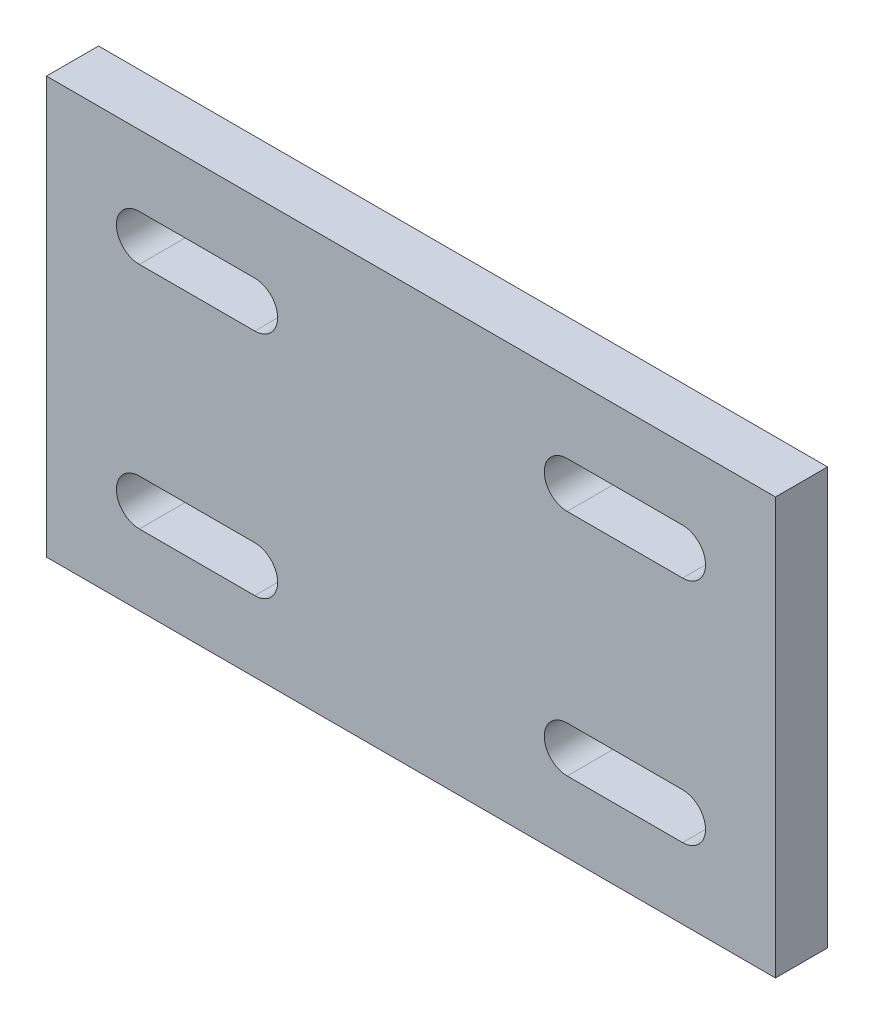
ISO-10303-21;
HEADER;
FILE_DESCRIPTION(('STEP AP214'),'2;1');
FILE_NAME('part.step','',(''),(''),'','','');
FILE_SCHEMA(('AUTOMOTIVE_DESIGN { 1 0 10303 214 1 1 1 1 }'));
ENDSEC;
DATA;
#1=APPLICATION_CONTEXT('core data for automotive mechanical design processes');
#2=APPLICATION_PROTOCOL_DEFINITION('international standard','automotive_design',2000,#1);
#3=PRODUCT_CONTEXT('',#1,'mechanical');
#4=PRODUCT('Part','Part','',(#3));
#5=PRODUCT_RELATED_PRODUCT_CATEGORY('part','',(#4));
#6=PRODUCT_DEFINITION_FORMATION('','',#4);
#7=PRODUCT_DEFINITION_CONTEXT('part definition',#1,'design');
#8=PRODUCT_DEFINITION('design','',#6,#7);
#9=PRODUCT_DEFINITION_SHAPE('','',#8);
#10=(LENGTH_UNIT() NAMED_UNIT(*) SI_UNIT(.MILLI.,.METRE.));
#11=(NAMED_UNIT(*) PLANE_ANGLE_UNIT() SI_UNIT($,.RADIAN.));
#12=(NAMED_UNIT(*) SI_UNIT($,.STERADIAN.) SOLID_ANGLE_UNIT());
#13=UNCERTAINTY_MEASURE_WITH_UNIT(LENGTH_MEASURE(1.E-05),#10,'distance_accuracy_value','');
#14=(GEOMETRIC_REPRESENTATION_CONTEXT(3) GLOBAL_UNCERTAINTY_ASSIGNED_CONTEXT((#13)) GLOBAL_UNIT_ASSIGNED_CONTEXT((#10,
#11,#12)) REPRESENTATION_CONTEXT('',''));
#15=CARTESIAN_POINT('',(0.,0.,0.));
#16=DIRECTION('',(0.,0.,1.));
#17=DIRECTION('',(1.,0.,0.));
#18=AXIS2_PLACEMENT_3D('',#15,#16,#17);
#19=CARTESIAN_POINT('',(0.,0.,5.));
#20=DIRECTION('',(0.,0.,-1.));
#21=DIRECTION('',(-1.,0.,0.));
#22=AXIS2_PLACEMENT_3D('',#19,#20,#21);
#23=PLANE('',#22);
#24=CARTESIAN_POINT('',(26.080867748854,11.,5.));
#25=DIRECTION('',(0.,0.,-1.));
#26=DIRECTION('',(-1.,0.,0.));
#27=AXIS2_PLACEMENT_3D('',#24,#25,#26);
#28=CIRCLE('',#27,2.2);
#29=CARTESIAN_POINT('',(26.080867748854,13.2,5.));
#30=VERTEX_POINT('',#29);
#31=CARTESIAN_POINT('',(26.080867748854,8.8,5.));
#32=VERTEX_POINT('',#31);
#33=EDGE_CURVE('E258',#30,#32,#28,.T.);
#34=ORIENTED_EDGE('',*,*,#33,.T.);
#35=DIRECTION('',(-1.,0.,0.));
#36=VECTOR('',#35,1.);
#37=CARTESIAN_POINT('',(26.080867748854,8.8,5.));
#38=LINE('',#37,#36);
#39=CARTESIAN_POINT('',(15.,8.8,5.));
#40=VERTEX_POINT('',#39);
#41=EDGE_CURVE('E272',#32,#40,#38,.T.);
#42=ORIENTED_EDGE('',*,*,#41,.T.);
#43=CARTESIAN_POINT('',(15.,11.,5.));
#44=DIRECTION('',(0.,0.,-1.));
#45=DIRECTION('',(-1.,0.,0.));
#46=AXIS2_PLACEMENT_3D('',#43,#44,#45);
#47=CIRCLE('',#46,2.2);
#48=CARTESIAN_POINT('',(15.,13.2,5.));
#49=VERTEX_POINT('',#48);
#50=EDGE_CURVE('E290',#40,#49,#47,.T.);
#51=ORIENTED_EDGE('',*,*,#50,.T.);
#52=DIRECTION('',(1.,0.,0.));
#53=VECTOR('',#52,1.);
#54=CARTESIAN_POINT('',(26.080867748854,13.2,5.));
#55=LINE('',#54,#53);
#56=EDGE_CURVE('E286',#49,#30,#55,.T.);
#57=ORIENTED_EDGE('',*,*,#56,.T.);
#58=EDGE_LOOP('',(#34,#42,#51,#57));
#59=FACE_BOUND('',#58,.T.);
#60=DIRECTION('',(1.,0.,0.));
#61=VECTOR('',#60,1.);
#62=CARTESIAN_POINT('',(-26.080867748854,8.8,5.));
#63=LINE('',#62,#61);
#64=CARTESIAN_POINT('',(-26.080867748854,8.8,5.));
#65=VERTEX_POINT('',#64);
#66=CARTESIAN_POINT('',(-15.,8.8,5.));
#67=VERTEX_POINT('',#66);
#68=EDGE_CURVE('E331',#65,#67,#63,.T.);
#69=ORIENTED_EDGE('',*,*,#68,.F.);
#70=CARTESIAN_POINT('',(-26.080867748854,11.,5.));
#71=DIRECTION('',(0.,0.,1.));
#72=DIRECTION('',(1.,0.,0.));
#73=AXIS2_PLACEMENT_3D('',#70,#71,#72);
#74=CIRCLE('',#73,2.2);
#75=CARTESIAN_POINT('',(-26.080867748854,13.2,5.));
#76=VERTEX_POINT('',#75);
#77=EDGE_CURVE('E301',#76,#65,#74,.T.);
#78=ORIENTED_EDGE('',*,*,#77,.F.);
#79=DIRECTION('',(-1.,0.,0.));
#80=VECTOR('',#79,1.);
#81=CARTESIAN_POINT('',(-26.080867748854,13.2,5.));
#82=LINE('',#81,#80);
#83=CARTESIAN_POINT('',(-15.,13.2,5.));
#84=VERTEX_POINT('',#83);
#85=EDGE_CURVE('E316',#84,#76,#82,.T.);
#86=ORIENTED_EDGE('',*,*,#85,.F.);
#87=CARTESIAN_POINT('',(-15.,11.,5.));
#88=DIRECTION('',(0.,0.,1.));
#89=DIRECTION('',(1.,0.,0.));
#90=AXIS2_PLACEMENT_3D('',#87,#88,#89);
#91=CIRCLE('',#90,2.2);
#92=EDGE_CURVE('E335',#67,#84,#91,.T.);
#93=ORIENTED_EDGE('',*,*,#92,.F.);
#94=EDGE_LOOP('',(#69,#78,#86,#93));
#95=FACE_BOUND('',#94,.T.);
#96=DIRECTION('',(0.,1.,0.));
#97=VECTOR('',#96,1.);
#98=CARTESIAN_POINT('',(35.,-20.,5.));
#99=LINE('',#98,#97);
#100=CARTESIAN_POINT('',(35.,-20.,5.));
#101=VERTEX_POINT('',#100);
#102=CARTESIAN_POINT('',(35.,20.,5.));
#103=VERTEX_POINT('',#102);
#104=EDGE_CURVE('E355',#101,#103,#99,.T.);
#105=ORIENTED_EDGE('',*,*,#104,.T.);
#106=DIRECTION('',(-1.,0.,0.));
#107=VECTOR('',#106,1.);
#108=CARTESIAN_POINT('',(-35.,20.,5.));
#109=LINE('',#108,#107);
#110=CARTESIAN_POINT('',(-35.,20.,5.));
#111=VERTEX_POINT('',#110);
#112=EDGE_CURVE('E359',#103,#111,#109,.T.);
#113=ORIENTED_EDGE('',*,*,#112,.T.);
#114=DIRECTION('',(0.,-1.,0.));
#115=VECTOR('',#114,1.);
#116=CARTESIAN_POINT('',(-35.,-20.,5.));
#117=LINE('',#116,#115);
#118=CARTESIAN_POINT('',(-35.,-20.,5.));
#119=VERTEX_POINT('',#118);
#120=EDGE_CURVE('E363',#111,#119,#117,.T.);
#121=ORIENTED_EDGE('',*,*,#120,.T.);
#122=DIRECTION('',(1.,0.,0.));
#123=VECTOR('',#122,1.);
#124=CARTESIAN_POINT('',(-35.,-20.,5.));
#125=LINE('',#124,#123);
#126=EDGE_CURVE('E366',#119,#101,#125,.T.);
#127=ORIENTED_EDGE('',*,*,#126,.T.);
#128=EDGE_LOOP('',(#105,#113,#121,#127));
#129=FACE_BOUND('',#128,.T.);
#130=DIRECTION('',(-1.,0.,0.));
#131=VECTOR('',#130,1.);
#132=CARTESIAN_POINT('',(26.080867748854,-8.8,5.));
#133=LINE('',#132,#131);
#134=CARTESIAN_POINT('',(26.080867748854,-8.8,5.));
#135=VERTEX_POINT('',#134);
#136=CARTESIAN_POINT('',(15.,-8.8,5.));
#137=VERTEX_POINT('',#136);
#138=EDGE_CURVE('E244',#135,#137,#133,.T.);
#139=ORIENTED_EDGE('',*,*,#138,.F.);
#140=CARTESIAN_POINT('',(26.080867748854,-11.,5.));
#141=DIRECTION('',(0.,0.,1.));
#142=DIRECTION('',(-1.,0.,0.));
#143=AXIS2_PLACEMENT_3D('',#140,#141,#142);
#144=CIRCLE('',#143,2.2);
#145=CARTESIAN_POINT('',(26.080867748854,-13.2,5.));
#146=VERTEX_POINT('',#145);
#147=EDGE_CURVE('E218',#146,#135,#144,.T.);
#148=ORIENTED_EDGE('',*,*,#147,.F.);
#149=DIRECTION('',(1.,0.,0.));
#150=VECTOR('',#149,1.);
#151=CARTESIAN_POINT('',(26.080867748854,-13.2,5.));
#152=LINE('',#151,#150);
#153=CARTESIAN_POINT('',(15.,-13.2,5.));
#154=VERTEX_POINT('',#153);
#155=EDGE_CURVE('E229',#154,#146,#152,.T.);
#156=ORIENTED_EDGE('',*,*,#155,.F.);
#157=CARTESIAN_POINT('',(15.,-11.,5.));
#158=DIRECTION('',(0.,0.,1.));
#159=DIRECTION('',(-1.,0.,0.));
#160=AXIS2_PLACEMENT_3D('',#157,#158,#159);
#161=CIRCLE('',#160,2.2);
#162=EDGE_CURVE('E248',#137,#154,#161,.T.);
#163=ORIENTED_EDGE('',*,*,#162,.F.);
#164=EDGE_LOOP('',(#139,#148,#156,#163));
#165=FACE_BOUND('',#164,.T.);
#166=CARTESIAN_POINT('',(-26.080867748854,-11.,5.));
#167=DIRECTION('',(0.,0.,-1.));
#168=DIRECTION('',(1.,0.,0.));
#169=AXIS2_PLACEMENT_3D('',#166,#167,#168);
#170=CIRCLE('',#169,2.2);
#171=CARTESIAN_POINT('',(-26.080867748854,-13.2,5.));
#172=VERTEX_POINT('',#171);
#173=CARTESIAN_POINT('',(-26.080867748854,-8.8,5.));
#174=VERTEX_POINT('',#173);
#175=EDGE_CURVE('E55',#172,#174,#170,.T.);
#176=ORIENTED_EDGE('',*,*,#175,.T.);
#177=DIRECTION('',(1.,0.,0.));
#178=VECTOR('',#177,1.);
#179=CARTESIAN_POINT('',(-26.080867748854,-8.8,5.));
#180=LINE('',#179,#178);
#181=CARTESIAN_POINT('',(-15.,-8.8,5.));
#182=VERTEX_POINT('',#181);
#183=EDGE_CURVE('E196',#174,#182,#180,.T.);
#184=ORIENTED_EDGE('',*,*,#183,.T.);
#185=CARTESIAN_POINT('',(-15.,-11.,5.));
#186=DIRECTION('',(0.,0.,-1.));
#187=DIRECTION('',(1.,0.,0.));
#188=AXIS2_PLACEMENT_3D('',#185,#186,#187);
#189=CIRCLE('',#188,2.2);
#190=CARTESIAN_POINT('',(-15.,-13.2,5.));
#191=VERTEX_POINT('',#190);
#192=EDGE_CURVE('E200',#182,#191,#189,.T.);
#193=ORIENTED_EDGE('',*,*,#192,.T.);
#194=DIRECTION('',(-1.,0.,0.));
#195=VECTOR('',#194,1.);
#196=CARTESIAN_POINT('',(-26.080867748854,-13.2,5.));
#197=LINE('',#196,#195);
#198=EDGE_CURVE('E209',#191,#172,#197,.T.);
#199=ORIENTED_EDGE('',*,*,#198,.T.);
#200=EDGE_LOOP('',(#176,#184,#193,#199));
#201=FACE_BOUND('',#200,.T.);
#202=ADVANCED_FACE('F39',(#59,#95,#129,#165,#201),#23,.F.);
#203=CARTESIAN_POINT('',(0.,0.,0.));
#204=DIRECTION('',(0.,0.,-1.));
#205=DIRECTION('',(-1.,0.,0.));
#206=AXIS2_PLACEMENT_3D('',#203,#204,#205);
#207=PLANE('',#206);
#208=CARTESIAN_POINT('',(26.080867748854,-11.,0.));
#209=DIRECTION('',(0.,0.,1.));
#210=DIRECTION('',(-1.,0.,0.));
#211=AXIS2_PLACEMENT_3D('',#208,#209,#210);
#212=CIRCLE('',#211,2.2);
#213=CARTESIAN_POINT('',(26.080867748854,-13.2,0.));
#214=VERTEX_POINT('',#213);
#215=CARTESIAN_POINT('',(26.080867748854,-8.8,0.));
#216=VERTEX_POINT('',#215);
#217=EDGE_CURVE('E224',#214,#216,#212,.T.);
#218=ORIENTED_EDGE('',*,*,#217,.T.);
#219=DIRECTION('',(-1.,0.,0.));
#220=VECTOR('',#219,1.);
#221=CARTESIAN_POINT('',(26.080867748854,-8.8,0.));
#222=LINE('',#221,#220);
#223=CARTESIAN_POINT('',(15.,-8.8,0.));
#224=VERTEX_POINT('',#223);
#225=EDGE_CURVE('E228',#216,#224,#222,.T.);
#226=ORIENTED_EDGE('',*,*,#225,.T.);
#227=CARTESIAN_POINT('',(15.,-11.,0.));
#228=DIRECTION('',(0.,0.,1.));
#229=DIRECTION('',(-1.,0.,0.));
#230=AXIS2_PLACEMENT_3D('',#227,#228,#229);
#231=CIRCLE('',#230,2.2);
#232=CARTESIAN_POINT('',(15.,-13.2,0.));
#233=VERTEX_POINT('',#232);
#234=EDGE_CURVE('E233',#224,#233,#231,.T.);
#235=ORIENTED_EDGE('',*,*,#234,.T.);
#236=DIRECTION('',(1.,0.,0.));
#237=VECTOR('',#236,1.);
#238=CARTESIAN_POINT('',(26.080867748854,-13.2,0.));
#239=LINE('',#238,#237);
#240=EDGE_CURVE('E237',#233,#214,#239,.T.);
#241=ORIENTED_EDGE('',*,*,#240,.T.);
#242=EDGE_LOOP('',(#218,#226,#235,#241));
#243=FACE_BOUND('',#242,.T.);
#244=CARTESIAN_POINT('',(-26.080867748854,11.,0.));
#245=DIRECTION('',(0.,0.,1.));
#246=DIRECTION('',(1.,0.,0.));
#247=AXIS2_PLACEMENT_3D('',#244,#245,#246);
#248=CIRCLE('',#247,2.2);
#249=CARTESIAN_POINT('',(-26.080867748854,13.2,0.));
#250=VERTEX_POINT('',#249);
#251=CARTESIAN_POINT('',(-26.080867748854,8.8,0.));
#252=VERTEX_POINT('',#251);
#253=EDGE_CURVE('E311',#250,#252,#248,.T.);
#254=ORIENTED_EDGE('',*,*,#253,.T.);
#255=DIRECTION('',(1.,0.,0.));
#256=VECTOR('',#255,1.);
#257=CARTESIAN_POINT('',(-26.080867748854,8.8,0.));
#258=LINE('',#257,#256);
#259=CARTESIAN_POINT('',(-15.,8.8,0.));
#260=VERTEX_POINT('',#259);
#261=EDGE_CURVE('E315',#252,#260,#258,.T.);
#262=ORIENTED_EDGE('',*,*,#261,.T.);
#263=CARTESIAN_POINT('',(-15.,11.,0.));
#264=DIRECTION('',(0.,0.,1.));
#265=DIRECTION('',(1.,0.,0.));
#266=AXIS2_PLACEMENT_3D('',#263,#264,#265);
#267=CIRCLE('',#266,2.2);
#268=CARTESIAN_POINT('',(-15.,13.2,0.));
#269=VERTEX_POINT('',#268);
#270=EDGE_CURVE('E320',#260,#269,#267,.T.);
#271=ORIENTED_EDGE('',*,*,#270,.T.);
#272=DIRECTION('',(-1.,0.,0.));
#273=VECTOR('',#272,1.);
#274=CARTESIAN_POINT('',(-26.080867748854,13.2,0.));
#275=LINE('',#274,#273);
#276=EDGE_CURVE('E324',#269,#250,#275,.T.);
#277=ORIENTED_EDGE('',*,*,#276,.T.);
#278=EDGE_LOOP('',(#254,#262,#271,#277));
#279=FACE_BOUND('',#278,.T.);
#280=DIRECTION('',(0.,1.,0.));
#281=VECTOR('',#280,1.);
#282=CARTESIAN_POINT('',(35.,-20.,0.));
#283=LINE('',#282,#281);
#284=CARTESIAN_POINT('',(35.,-20.,0.));
#285=VERTEX_POINT('',#284);
#286=CARTESIAN_POINT('',(35.,20.,0.));
#287=VERTEX_POINT('',#286);
#288=EDGE_CURVE('E345',#285,#287,#283,.T.);
#289=ORIENTED_EDGE('',*,*,#288,.F.);
#290=DIRECTION('',(1.,0.,0.));
#291=VECTOR('',#290,1.);
#292=CARTESIAN_POINT('',(-35.,-20.,0.));
#293=LINE('',#292,#291);
#294=CARTESIAN_POINT('',(-35.,-20.,0.));
#295=VERTEX_POINT('',#294);
#296=EDGE_CURVE('E360',#295,#285,#293,.T.);
#297=ORIENTED_EDGE('',*,*,#296,.F.);
#298=DIRECTION('',(0.,-1.,0.));
#299=VECTOR('',#298,1.);
#300=CARTESIAN_POINT('',(-35.,-20.,0.));
#301=LINE('',#300,#299);
#302=CARTESIAN_POINT('',(-35.,20.,0.));
#303=VERTEX_POINT('',#302);
#304=EDGE_CURVE('E376',#303,#295,#301,.T.);
#305=ORIENTED_EDGE('',*,*,#304,.F.);
#306=DIRECTION('',(-1.,0.,0.));
#307=VECTOR('',#306,1.);
#308=CARTESIAN_POINT('',(-35.,20.,0.));
#309=LINE('',#308,#307);
#310=EDGE_CURVE('E373',#287,#303,#309,.T.);
#311=ORIENTED_EDGE('',*,*,#310,.F.);
#312=EDGE_LOOP('',(#289,#297,#305,#311));
#313=FACE_BOUND('',#312,.T.);
#314=DIRECTION('',(-1.,0.,0.));
#315=VECTOR('',#314,1.);
#316=CARTESIAN_POINT('',(26.080867748854,8.8,0.));
#317=LINE('',#316,#315);
#318=CARTESIAN_POINT('',(26.080867748854,8.8,0.));
#319=VERTEX_POINT('',#318);
#320=CARTESIAN_POINT('',(15.,8.8,0.));
#321=VERTEX_POINT('',#320);
#322=EDGE_CURVE('E279',#319,#321,#317,.T.);
#323=ORIENTED_EDGE('',*,*,#322,.F.);
#324=CARTESIAN_POINT('',(26.080867748854,11.,0.));
#325=DIRECTION('',(0.,0.,-1.));
#326=DIRECTION('',(-1.,0.,0.));
#327=AXIS2_PLACEMENT_3D('',#324,#325,#326);
#328=CIRCLE('',#327,2.2);
#329=CARTESIAN_POINT('',(26.080867748854,13.2,0.));
#330=VERTEX_POINT('',#329);
#331=EDGE_CURVE('E268',#330,#319,#328,.T.);
#332=ORIENTED_EDGE('',*,*,#331,.F.);
#333=DIRECTION('',(1.,0.,0.));
#334=VECTOR('',#333,1.);
#335=CARTESIAN_POINT('',(26.080867748854,13.2,0.));
#336=LINE('',#335,#334);
#337=CARTESIAN_POINT('',(15.,13.2,0.));
#338=VERTEX_POINT('',#337);
#339=EDGE_CURVE('E271',#338,#330,#336,.T.);
#340=ORIENTED_EDGE('',*,*,#339,.F.);
#341=CARTESIAN_POINT('',(15.,11.,0.));
#342=DIRECTION('',(0.,0.,-1.));
#343=DIRECTION('',(-1.,0.,0.));
#344=AXIS2_PLACEMENT_3D('',#341,#342,#343);
#345=CIRCLE('',#344,2.2);
#346=EDGE_CURVE('E275',#321,#338,#345,.T.);
#347=ORIENTED_EDGE('',*,*,#346,.F.);
#348=EDGE_LOOP('',(#323,#332,#340,#347));
#349=FACE_BOUND('',#348,.T.);
#350=DIRECTION('',(1.,0.,0.));
#351=VECTOR('',#350,1.);
#352=CARTESIAN_POINT('',(-26.080867748854,-8.8,0.));
#353=LINE('',#352,#351);
#354=CARTESIAN_POINT('',(-26.080867748854,-8.8,0.));
#355=VERTEX_POINT('',#354);
#356=CARTESIAN_POINT('',(-15.,-8.8,0.));
#357=VERTEX_POINT('',#356);
#358=EDGE_CURVE('E191',#355,#357,#353,.T.);
#359=ORIENTED_EDGE('',*,*,#358,.F.);
#360=CARTESIAN_POINT('',(-26.080867748854,-11.,0.));
#361=DIRECTION('',(0.,0.,-1.));
#362=DIRECTION('',(1.,0.,0.));
#363=AXIS2_PLACEMENT_3D('',#360,#361,#362);
#364=CIRCLE('',#363,2.2);
#365=CARTESIAN_POINT('',(-26.080867748854,-13.2,0.));
#366=VERTEX_POINT('',#365);
#367=EDGE_CURVE('E186',#366,#355,#364,.T.);
#368=ORIENTED_EDGE('',*,*,#367,.F.);
#369=DIRECTION('',(-1.,0.,0.));
#370=VECTOR('',#369,1.);
#371=CARTESIAN_POINT('',(-26.080867748854,-13.2,0.));
#372=LINE('',#371,#370);
#373=CARTESIAN_POINT('',(-15.,-13.2,0.));
#374=VERTEX_POINT('',#373);
#375=EDGE_CURVE('E177',#374,#366,#372,.T.);
#376=ORIENTED_EDGE('',*,*,#375,.F.);
#377=CARTESIAN_POINT('',(-15.,-11.,0.));
#378=DIRECTION('',(0.,0.,-1.));
#379=DIRECTION('',(1.,0.,0.));
#380=AXIS2_PLACEMENT_3D('',#377,#378,#379);
#381=CIRCLE('',#380,2.2);
#382=EDGE_CURVE('E185',#357,#374,#381,.T.);
#383=ORIENTED_EDGE('',*,*,#382,.F.);
#384=EDGE_LOOP('',(#359,#368,#376,#383));
#385=FACE_BOUND('',#384,.T.);
#386=ADVANCED_FACE('F194',(#243,#279,#313,#349,#385),#207,.T.);
#387=CARTESIAN_POINT('',(35.,-20.,5.));
#388=DIRECTION('',(-1.,0.,0.));
#389=DIRECTION('',(0.,0.,1.));
#390=AXIS2_PLACEMENT_3D('',#387,#388,#389);
#391=PLANE('',#390);
#392=ORIENTED_EDGE('',*,*,#288,.T.);
#393=DIRECTION('',(0.,0.,-1.));
#394=VECTOR('',#393,1.);
#395=CARTESIAN_POINT('',(35.,20.,5.));
#396=LINE('',#395,#394);
#397=EDGE_CURVE('E11',#103,#287,#396,.T.);
#398=ORIENTED_EDGE('',*,*,#397,.F.);
#399=ORIENTED_EDGE('',*,*,#104,.F.);
#400=DIRECTION('',(0.,0.,-1.));
#401=VECTOR('',#400,1.);
#402=CARTESIAN_POINT('',(35.,-20.,5.));
#403=LINE('',#402,#401);
#404=EDGE_CURVE('E369',#101,#285,#403,.T.);
#405=ORIENTED_EDGE('',*,*,#404,.T.);
#406=EDGE_LOOP('',(#392,#398,#399,#405));
#407=FACE_BOUND('',#406,.T.);
#408=ADVANCED_FACE('F41',(#407),#391,.F.);
#409=CARTESIAN_POINT('',(-35.,20.,5.));
#410=DIRECTION('',(0.,-1.,0.));
#411=DIRECTION('',(0.,0.,-1.));
#412=AXIS2_PLACEMENT_3D('',#409,#410,#411);
#413=PLANE('',#412);
#414=ORIENTED_EDGE('',*,*,#310,.T.);
#415=DIRECTION('',(0.,0.,-1.));
#416=VECTOR('',#415,1.);
#417=CARTESIAN_POINT('',(-35.,20.,5.));
#418=LINE('',#417,#416);
#419=EDGE_CURVE('E48',#111,#303,#418,.T.);
#420=ORIENTED_EDGE('',*,*,#419,.F.);
#421=ORIENTED_EDGE('',*,*,#112,.F.);
#422=ORIENTED_EDGE('',*,*,#397,.T.);
#423=EDGE_LOOP('',(#414,#420,#421,#422));
#424=FACE_BOUND('',#423,.T.);
#425=ADVANCED_FACE('F409',(#424),#413,.F.);
#426=CARTESIAN_POINT('',(-35.,-20.,5.));
#427=DIRECTION('',(1.,0.,0.));
#428=DIRECTION('',(0.,0.,-1.));
#429=AXIS2_PLACEMENT_3D('',#426,#427,#428);
#430=PLANE('',#429);
#431=ORIENTED_EDGE('',*,*,#304,.T.);
#432=DIRECTION('',(0.,0.,-1.));
#433=VECTOR('',#432,1.);
#434=CARTESIAN_POINT('',(-35.,-20.,5.));
#435=LINE('',#434,#433);
#436=EDGE_CURVE('E384',#119,#295,#435,.T.);
#437=ORIENTED_EDGE('',*,*,#436,.F.);
#438=ORIENTED_EDGE('',*,*,#120,.F.);
#439=ORIENTED_EDGE('',*,*,#419,.T.);
#440=EDGE_LOOP('',(#431,#437,#438,#439));
#441=FACE_BOUND('',#440,.T.);
#442=ADVANCED_FACE('F393',(#441),#430,.F.);
#443=CARTESIAN_POINT('',(-35.,-20.,5.));
#444=DIRECTION('',(0.,1.,0.));
#445=DIRECTION('',(0.,0.,1.));
#446=AXIS2_PLACEMENT_3D('',#443,#444,#445);
#447=PLANE('',#446);
#448=ORIENTED_EDGE('',*,*,#296,.T.);
#449=ORIENTED_EDGE('',*,*,#404,.F.);
#450=ORIENTED_EDGE('',*,*,#126,.F.);
#451=ORIENTED_EDGE('',*,*,#436,.T.);
#452=EDGE_LOOP('',(#448,#449,#450,#451));
#453=FACE_BOUND('',#452,.T.);
#454=ADVANCED_FACE('F402',(#453),#447,.F.);
#455=CARTESIAN_POINT('',(-26.080867748854,11.,0.));
#456=DIRECTION('',(0.,0.,1.));
#457=DIRECTION('',(1.,0.,0.));
#458=AXIS2_PLACEMENT_3D('',#455,#456,#457);
#459=CYLINDRICAL_SURFACE('',#458,2.2);
#460=ORIENTED_EDGE('',*,*,#77,.T.);
#461=DIRECTION('',(0.,0.,1.));
#462=VECTOR('',#461,1.);
#463=CARTESIAN_POINT('',(-26.080867748854,8.8,0.));
#464=LINE('',#463,#462);
#465=EDGE_CURVE('E328',#252,#65,#464,.T.);
#466=ORIENTED_EDGE('',*,*,#465,.F.);
#467=ORIENTED_EDGE('',*,*,#253,.F.);
#468=DIRECTION('',(0.,0.,1.));
#469=VECTOR('',#468,1.);
#470=CARTESIAN_POINT('',(-26.080867748854,13.2,0.));
#471=LINE('',#470,#469);
#472=EDGE_CURVE('E342',#250,#76,#471,.T.);
#473=ORIENTED_EDGE('',*,*,#472,.T.);
#474=EDGE_LOOP('',(#460,#466,#467,#473));
#475=FACE_BOUND('',#474,.T.);
#476=ADVANCED_FACE('F426',(#475),#459,.F.);
#477=CARTESIAN_POINT('',(-26.080867748854,13.2,0.));
#478=DIRECTION('',(0.,1.,0.));
#479=DIRECTION('',(0.,0.,1.));
#480=AXIS2_PLACEMENT_3D('',#477,#478,#479);
#481=PLANE('',#480);
#482=ORIENTED_EDGE('',*,*,#85,.T.);
#483=ORIENTED_EDGE('',*,*,#472,.F.);
#484=ORIENTED_EDGE('',*,*,#276,.F.);
#485=DIRECTION('',(0.,0.,1.));
#486=VECTOR('',#485,1.);
#487=CARTESIAN_POINT('',(-15.,13.2,0.));
#488=LINE('',#487,#486);
#489=EDGE_CURVE('E346',#269,#84,#488,.T.);
#490=ORIENTED_EDGE('',*,*,#489,.T.);
#491=EDGE_LOOP('',(#482,#483,#484,#490));
#492=FACE_BOUND('',#491,.T.);
#493=ADVANCED_FACE('F433',(#492),#481,.F.);
#494=CARTESIAN_POINT('',(-15.,11.,0.));
#495=DIRECTION('',(0.,0.,1.));
#496=DIRECTION('',(1.,0.,0.));
#497=AXIS2_PLACEMENT_3D('',#494,#495,#496);
#498=CYLINDRICAL_SURFACE('',#497,2.2);
#499=ORIENTED_EDGE('',*,*,#92,.T.);
#500=ORIENTED_EDGE('',*,*,#489,.F.);
#501=ORIENTED_EDGE('',*,*,#270,.F.);
#502=DIRECTION('',(0.,0.,1.));
#503=VECTOR('',#502,1.);
#504=CARTESIAN_POINT('',(-15.,8.8,0.));
#505=LINE('',#504,#503);
#506=EDGE_CURVE('E349',#260,#67,#505,.T.);
#507=ORIENTED_EDGE('',*,*,#506,.T.);
#508=EDGE_LOOP('',(#499,#500,#501,#507));
#509=FACE_BOUND('',#508,.T.);
#510=ADVANCED_FACE('F438',(#509),#498,.F.);
#511=CARTESIAN_POINT('',(-26.080867748854,8.8,0.));
#512=DIRECTION('',(0.,-1.,0.));
#513=DIRECTION('',(0.,0.,-1.));
#514=AXIS2_PLACEMENT_3D('',#511,#512,#513);
#515=PLANE('',#514);
#516=ORIENTED_EDGE('',*,*,#68,.T.);
#517=ORIENTED_EDGE('',*,*,#506,.F.);
#518=ORIENTED_EDGE('',*,*,#261,.F.);
#519=ORIENTED_EDGE('',*,*,#465,.T.);
#520=EDGE_LOOP('',(#516,#517,#518,#519));
#521=FACE_BOUND('',#520,.T.);
#522=ADVANCED_FACE('F447',(#521),#515,.F.);
#523=CARTESIAN_POINT('',(26.080867748854,11.,0.));
#524=DIRECTION('',(0.,0.,1.));
#525=DIRECTION('',(1.,0.,0.));
#526=AXIS2_PLACEMENT_3D('',#523,#524,#525);
#527=CYLINDRICAL_SURFACE('',#526,2.2);
#528=ORIENTED_EDGE('',*,*,#33,.F.);
#529=DIRECTION('',(0.,0.,1.));
#530=VECTOR('',#529,1.);
#531=CARTESIAN_POINT('',(26.080867748854,13.2,0.));
#532=LINE('',#531,#530);
#533=EDGE_CURVE('E282',#330,#30,#532,.T.);
#534=ORIENTED_EDGE('',*,*,#533,.F.);
#535=ORIENTED_EDGE('',*,*,#331,.T.);
#536=DIRECTION('',(0.,0.,1.));
#537=VECTOR('',#536,1.);
#538=CARTESIAN_POINT('',(26.080867748854,8.8,0.));
#539=LINE('',#538,#537);
#540=EDGE_CURVE('E297',#319,#32,#539,.T.);
#541=ORIENTED_EDGE('',*,*,#540,.T.);
#542=EDGE_LOOP('',(#528,#534,#535,#541));
#543=FACE_BOUND('',#542,.T.);
#544=ADVANCED_FACE('F458',(#543),#527,.F.);
#545=CARTESIAN_POINT('',(26.080867748854,8.8,0.));
#546=DIRECTION('',(0.,1.,0.));
#547=DIRECTION('',(0.,0.,1.));
#548=AXIS2_PLACEMENT_3D('',#545,#546,#547);
#549=PLANE('',#548);
#550=ORIENTED_EDGE('',*,*,#41,.F.);
#551=ORIENTED_EDGE('',*,*,#540,.F.);
#552=ORIENTED_EDGE('',*,*,#322,.T.);
#553=DIRECTION('',(0.,0.,1.));
#554=VECTOR('',#553,1.);
#555=CARTESIAN_POINT('',(15.,8.8,0.));
#556=LINE('',#555,#554);
#557=EDGE_CURVE('E302',#321,#40,#556,.T.);
#558=ORIENTED_EDGE('',*,*,#557,.T.);
#559=EDGE_LOOP('',(#550,#551,#552,#558));
#560=FACE_BOUND('',#559,.T.);
#561=ADVANCED_FACE('F462',(#560),#549,.T.);
#562=CARTESIAN_POINT('',(15.,11.,0.));
#563=DIRECTION('',(0.,0.,1.));
#564=DIRECTION('',(1.,0.,0.));
#565=AXIS2_PLACEMENT_3D('',#562,#563,#564);
#566=CYLINDRICAL_SURFACE('',#565,2.2);
#567=ORIENTED_EDGE('',*,*,#50,.F.);
#568=ORIENTED_EDGE('',*,*,#557,.F.);
#569=ORIENTED_EDGE('',*,*,#346,.T.);
#570=DIRECTION('',(0.,0.,1.));
#571=VECTOR('',#570,1.);
#572=CARTESIAN_POINT('',(15.,13.2,0.));
#573=LINE('',#572,#571);
#574=EDGE_CURVE('E305',#338,#49,#573,.T.);
#575=ORIENTED_EDGE('',*,*,#574,.T.);
#576=EDGE_LOOP('',(#567,#568,#569,#575));
#577=FACE_BOUND('',#576,.T.);
#578=ADVANCED_FACE('F468',(#577),#566,.F.);
#579=CARTESIAN_POINT('',(26.080867748854,13.2,0.));
#580=DIRECTION('',(0.,-1.,0.));
#581=DIRECTION('',(0.,0.,-1.));
#582=AXIS2_PLACEMENT_3D('',#579,#580,#581);
#583=PLANE('',#582);
#584=ORIENTED_EDGE('',*,*,#56,.F.);
#585=ORIENTED_EDGE('',*,*,#574,.F.);
#586=ORIENTED_EDGE('',*,*,#339,.T.);
#587=ORIENTED_EDGE('',*,*,#533,.T.);
#588=EDGE_LOOP('',(#584,#585,#586,#587));
#589=FACE_BOUND('',#588,.T.);
#590=ADVANCED_FACE('F464',(#589),#583,.T.);
#591=CARTESIAN_POINT('',(26.080867748854,-11.,0.));
#592=DIRECTION('',(0.,0.,1.));
#593=DIRECTION('',(1.,0.,0.));
#594=AXIS2_PLACEMENT_3D('',#591,#592,#593);
#595=CYLINDRICAL_SURFACE('',#594,2.2);
#596=ORIENTED_EDGE('',*,*,#147,.T.);
#597=DIRECTION('',(0.,0.,1.));
#598=VECTOR('',#597,1.);
#599=CARTESIAN_POINT('',(26.080867748854,-8.8,0.));
#600=LINE('',#599,#598);
#601=EDGE_CURVE('E241',#216,#135,#600,.T.);
#602=ORIENTED_EDGE('',*,*,#601,.F.);
#603=ORIENTED_EDGE('',*,*,#217,.F.);
#604=DIRECTION('',(0.,0.,1.));
#605=VECTOR('',#604,1.);
#606=CARTESIAN_POINT('',(26.080867748854,-13.2,0.));
#607=LINE('',#606,#605);
#608=EDGE_CURVE('E255',#214,#146,#607,.T.);
#609=ORIENTED_EDGE('',*,*,#608,.T.);
#610=EDGE_LOOP('',(#596,#602,#603,#609));
#611=FACE_BOUND('',#610,.T.);
#612=ADVANCED_FACE('F467',(#611),#595,.F.);
#613=CARTESIAN_POINT('',(26.080867748854,-13.2,0.));
#614=DIRECTION('',(0.,-1.,0.));
#615=DIRECTION('',(0.,0.,-1.));
#616=AXIS2_PLACEMENT_3D('',#613,#614,#615);
#617=PLANE('',#616);
#618=ORIENTED_EDGE('',*,*,#155,.T.);
#619=ORIENTED_EDGE('',*,*,#608,.F.);
#620=ORIENTED_EDGE('',*,*,#240,.F.);
#621=DIRECTION('',(0.,0.,1.));
#622=VECTOR('',#621,1.);
#623=CARTESIAN_POINT('',(15.,-13.2,0.));
#624=LINE('',#623,#622);
#625=EDGE_CURVE('E259',#233,#154,#624,.T.);
#626=ORIENTED_EDGE('',*,*,#625,.T.);
#627=EDGE_LOOP('',(#618,#619,#620,#626));
#628=FACE_BOUND('',#627,.T.);
#629=ADVANCED_FACE('F478',(#628),#617,.F.);
#630=CARTESIAN_POINT('',(15.,-11.,0.));
#631=DIRECTION('',(0.,0.,1.));
#632=DIRECTION('',(1.,0.,0.));
#633=AXIS2_PLACEMENT_3D('',#630,#631,#632);
#634=CYLINDRICAL_SURFACE('',#633,2.2);
#635=ORIENTED_EDGE('',*,*,#162,.T.);
#636=ORIENTED_EDGE('',*,*,#625,.F.);
#637=ORIENTED_EDGE('',*,*,#234,.F.);
#638=DIRECTION('',(0.,0.,1.));
#639=VECTOR('',#638,1.);
#640=CARTESIAN_POINT('',(15.,-8.8,0.));
#641=LINE('',#640,#639);
#642=EDGE_CURVE('E262',#224,#137,#641,.T.);
#643=ORIENTED_EDGE('',*,*,#642,.T.);
#644=EDGE_LOOP('',(#635,#636,#637,#643));
#645=FACE_BOUND('',#644,.T.);
#646=ADVANCED_FACE('F483',(#645),#634,.F.);
#647=CARTESIAN_POINT('',(26.080867748854,-8.8,0.));
#648=DIRECTION('',(0.,1.,0.));
#649=DIRECTION('',(0.,0.,1.));
#650=AXIS2_PLACEMENT_3D('',#647,#648,#649);
#651=PLANE('',#650);
#652=ORIENTED_EDGE('',*,*,#138,.T.);
#653=ORIENTED_EDGE('',*,*,#642,.F.);
#654=ORIENTED_EDGE('',*,*,#225,.F.);
#655=ORIENTED_EDGE('',*,*,#601,.T.);
#656=EDGE_LOOP('',(#652,#653,#654,#655));
#657=FACE_BOUND('',#656,.T.);
#658=ADVANCED_FACE('F480',(#657),#651,.F.);
#659=CARTESIAN_POINT('',(-26.080867748854,-11.,0.));
#660=DIRECTION('',(0.,0.,1.));
#661=DIRECTION('',(1.,0.,0.));
#662=AXIS2_PLACEMENT_3D('',#659,#660,#661);
#663=CYLINDRICAL_SURFACE('',#662,2.2);
#664=ORIENTED_EDGE('',*,*,#175,.F.);
#665=DIRECTION('',(0.,0.,1.));
#666=VECTOR('',#665,1.);
#667=CARTESIAN_POINT('',(-26.080867748854,-13.2,0.));
#668=LINE('',#667,#666);
#669=EDGE_CURVE('E179',#366,#172,#668,.T.);
#670=ORIENTED_EDGE('',*,*,#669,.F.);
#671=ORIENTED_EDGE('',*,*,#367,.T.);
#672=DIRECTION('',(0.,0.,1.));
#673=VECTOR('',#672,1.);
#674=CARTESIAN_POINT('',(-26.080867748854,-8.8,0.));
#675=LINE('',#674,#673);
#676=EDGE_CURVE('E215',#355,#174,#675,.T.);
#677=ORIENTED_EDGE('',*,*,#676,.T.);
#678=EDGE_LOOP('',(#664,#670,#671,#677));
#679=FACE_BOUND('',#678,.T.);
#680=ADVANCED_FACE('F188',(#679),#663,.F.);
#681=CARTESIAN_POINT('',(-26.080867748854,-8.8,0.));
#682=DIRECTION('',(0.,-1.,0.));
#683=DIRECTION('',(0.,0.,-1.));
#684=AXIS2_PLACEMENT_3D('',#681,#682,#683);
#685=PLANE('',#684);
#686=ORIENTED_EDGE('',*,*,#183,.F.);
#687=ORIENTED_EDGE('',*,*,#676,.F.);
#688=ORIENTED_EDGE('',*,*,#358,.T.);
#689=DIRECTION('',(0.,0.,1.));
#690=VECTOR('',#689,1.);
#691=CARTESIAN_POINT('',(-15.,-8.8,0.));
#692=LINE('',#691,#690);
#693=EDGE_CURVE('E219',#357,#182,#692,.T.);
#694=ORIENTED_EDGE('',*,*,#693,.T.);
#695=EDGE_LOOP('',(#686,#687,#688,#694));
#696=FACE_BOUND('',#695,.T.);
#697=ADVANCED_FACE('F493',(#696),#685,.T.);
#698=CARTESIAN_POINT('',(-15.,-11.,0.));
#699=DIRECTION('',(0.,0.,1.));
#700=DIRECTION('',(1.,0.,0.));
#701=AXIS2_PLACEMENT_3D('',#698,#699,#700);
#702=CYLINDRICAL_SURFACE('',#701,2.2);
#703=ORIENTED_EDGE('',*,*,#192,.F.);
#704=ORIENTED_EDGE('',*,*,#693,.F.);
#705=ORIENTED_EDGE('',*,*,#382,.T.);
#706=DIRECTION('',(0.,0.,1.));
#707=VECTOR('',#706,1.);
#708=CARTESIAN_POINT('',(-15.,-13.2,0.));
#709=LINE('',#708,#707);
#710=EDGE_CURVE('E63',#374,#191,#709,.T.);
#711=ORIENTED_EDGE('',*,*,#710,.T.);
#712=EDGE_LOOP('',(#703,#704,#705,#711));
#713=FACE_BOUND('',#712,.T.);
#714=ADVANCED_FACE('F496',(#713),#702,.F.);
#715=CARTESIAN_POINT('',(-26.080867748854,-13.2,0.));
#716=DIRECTION('',(0.,1.,0.));
#717=DIRECTION('',(0.,0.,1.));
#718=AXIS2_PLACEMENT_3D('',#715,#716,#717);
#719=PLANE('',#718);
#720=ORIENTED_EDGE('',*,*,#198,.F.);
#721=ORIENTED_EDGE('',*,*,#710,.F.);
#722=ORIENTED_EDGE('',*,*,#375,.T.);
#723=ORIENTED_EDGE('',*,*,#669,.T.);
#724=EDGE_LOOP('',(#720,#721,#722,#723));
#725=FACE_BOUND('',#724,.T.);
#726=ADVANCED_FACE('F178',(#725),#719,.T.);
#727=CLOSED_SHELL('',(#202,#386,#408,#425,#442,#454,#476,#493,#510,#522,#544,#561,#578,#590,
#612,#629,#646,#658,#680,#697,#714,#726));
#728=MANIFOLD_SOLID_BREP('B2',#727);
#729=ADVANCED_BREP_SHAPE_REPRESENTATION('',(#18,#728),#14);
#730=SHAPE_DEFINITION_REPRESENTATION(#9,#729);
ENDSEC;
END-ISO-10303-21;
